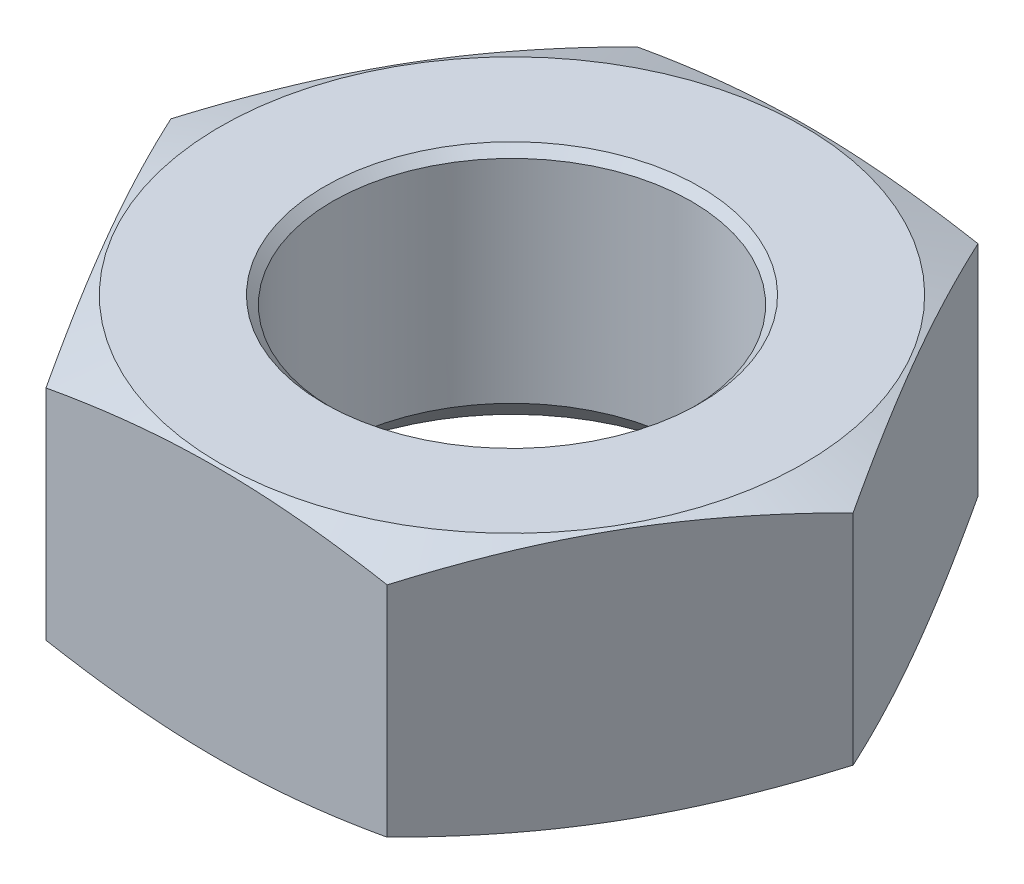
ISO-10303-21;
HEADER;
FILE_DESCRIPTION(('STEP AP214'),'2;1');
FILE_NAME('part.step','',(''),(''),'','','');
FILE_SCHEMA(('AUTOMOTIVE_DESIGN { 1 0 10303 214 1 1 1 1 }'));
ENDSEC;
DATA;
#1=APPLICATION_CONTEXT('core data for automotive mechanical design processes');
#2=APPLICATION_PROTOCOL_DEFINITION('international standard','automotive_design',2000,#1);
#3=PRODUCT_CONTEXT('',#1,'mechanical');
#4=PRODUCT('Part','Part','',(#3));
#5=PRODUCT_RELATED_PRODUCT_CATEGORY('part','',(#4));
#6=PRODUCT_DEFINITION_FORMATION('','',#4);
#7=PRODUCT_DEFINITION_CONTEXT('part definition',#1,'design');
#8=PRODUCT_DEFINITION('design','',#6,#7);
#9=PRODUCT_DEFINITION_SHAPE('','',#8);
#10=(LENGTH_UNIT() NAMED_UNIT(*) SI_UNIT(.MILLI.,.METRE.));
#11=(NAMED_UNIT(*) PLANE_ANGLE_UNIT() SI_UNIT($,.RADIAN.));
#12=(NAMED_UNIT(*) SI_UNIT($,.STERADIAN.) SOLID_ANGLE_UNIT());
#13=UNCERTAINTY_MEASURE_WITH_UNIT(LENGTH_MEASURE(1.E-05),#10,'distance_accuracy_value','');
#14=(GEOMETRIC_REPRESENTATION_CONTEXT(3) GLOBAL_UNCERTAINTY_ASSIGNED_CONTEXT((#13)) GLOBAL_UNIT_ASSIGNED_CONTEXT((#10,
#11,#12)) REPRESENTATION_CONTEXT('',''));
#15=CARTESIAN_POINT('',(0.,0.,0.));
#16=DIRECTION('',(0.,0.,1.));
#17=DIRECTION('',(1.,0.,0.));
#18=AXIS2_PLACEMENT_3D('',#15,#16,#17);
#19=CARTESIAN_POINT('',(8.08290376865476,6.,0.));
#20=DIRECTION('',(-0.866025403784438,0.,0.5));
#21=DIRECTION('',(0.5,0.,0.866025403784439));
#22=AXIS2_PLACEMENT_3D('',#19,#20,#21);
#23=PLANE('',#22);
#24=CARTESIAN_POINT('',(4.04133641427354,0.396064374006002,-7.0002));
#25=CARTESIAN_POINT('',(4.20871133711686,0.335122246639036,-6.71029812972245));
#26=CARTESIAN_POINT('',(4.37663818867554,0.279684845159645,-6.41944029086774));
#27=CARTESIAN_POINT('',(4.71358376499552,0.182151327336367,-5.83583343329596));
#28=CARTESIAN_POINT('',(4.88260323922986,0.140065650577549,-5.5430831164535));
#29=CARTESIAN_POINT('',(5.21985834048189,0.0719932787650603,-4.9589401459732));
#30=CARTESIAN_POINT('',(5.3880862654455,0.0458581080277517,-4.66756083268434));
#31=CARTESIAN_POINT('',(5.72493551662129,0.0108034998647016,-4.08412081515635));
#32=CARTESIAN_POINT('',(5.89355667155618,0.00187760707785246,-3.79206040757817));
#33=CARTESIAN_POINT('',(6.23079898142596,0.00187760707785257,-3.20793959242183));
#34=CARTESIAN_POINT('',(6.39942013636085,0.0108034998647018,-2.91587918484365));
#35=CARTESIAN_POINT('',(6.73626938753664,0.0458581080277517,-2.33243916731566));
#36=CARTESIAN_POINT('',(6.90449731250025,0.07199327876506,-2.0410598540268));
#37=CARTESIAN_POINT('',(7.24175241375227,0.140065650577549,-1.45691688354651));
#38=CARTESIAN_POINT('',(7.41077188798662,0.182151327336367,-1.16416656670404));
#39=CARTESIAN_POINT('',(7.7477174643066,0.279684845159646,-0.580559709132259));
#40=CARTESIAN_POINT('',(7.91564431586528,0.335122246639037,-0.289701870277549));
#41=CARTESIAN_POINT('',(8.0830192387086,0.396064374006002,0.000199999999999736));
#42=B_SPLINE_CURVE_WITH_KNOTS('',3,(#24,#25,#26,#27,#28,#29,#30,#31,#32,#33,#34,#35,#36,#37,#38,
#39,#40,#41),.UNSPECIFIED.,.F.,.F.,(4,2,2,2,2,2,2,2,4),(0.,1.02086119756332,2.04251864059741,
3.05451483401204,4.06613134427776,5.07774785454349,6.08974404795812,7.11140149099221,
8.13226268855553),.UNSPECIFIED.);
#43=CARTESIAN_POINT('',(4.04145188432738,0.396022345442876,-7.));
#44=VERTEX_POINT('',#43);
#45=CARTESIAN_POINT('',(8.08290376865476,0.396022345442876,0.));
#46=VERTEX_POINT('',#45);
#47=EDGE_CURVE('E66',#44,#46,#42,.T.);
#48=ORIENTED_EDGE('',*,*,#47,.F.);
#49=DIRECTION('',(0.,-1.,0.));
#50=VECTOR('',#49,1.);
#51=CARTESIAN_POINT('',(4.04145188432738,6.,-7.));
#52=LINE('',#51,#50);
#53=CARTESIAN_POINT('',(4.04145188432738,5.57467753879998,-7.));
#54=VERTEX_POINT('',#53);
#55=EDGE_CURVE('E136',#54,#44,#52,.T.);
#56=ORIENTED_EDGE('',*,*,#55,.F.);
#57=CARTESIAN_POINT('',(8.0830192387086,5.57463551023685,0.000199999999998542));
#58=CARTESIAN_POINT('',(7.91564431586528,5.63557763760382,-0.289701870277549));
#59=CARTESIAN_POINT('',(7.7477174643066,5.69101503908321,-0.58055970913226));
#60=CARTESIAN_POINT('',(7.41077188798662,5.78854855690649,-1.16416656670404));
#61=CARTESIAN_POINT('',(7.24175241375227,5.83063423366531,-1.45691688354651));
#62=CARTESIAN_POINT('',(6.90449731250025,5.89870660547779,-2.0410598540268));
#63=CARTESIAN_POINT('',(6.73626938753664,5.9248417762151,-2.33243916731566));
#64=CARTESIAN_POINT('',(6.39942013636085,5.95989638437815,-2.91587918484365));
#65=CARTESIAN_POINT('',(6.23079898142596,5.968822277165,-3.20793959242183));
#66=CARTESIAN_POINT('',(5.89355667155618,5.968822277165,-3.79206040757818));
#67=CARTESIAN_POINT('',(5.72493551662129,5.95989638437815,-4.08412081515635));
#68=CARTESIAN_POINT('',(5.3880862654455,5.9248417762151,-4.66756083268435));
#69=CARTESIAN_POINT('',(5.21985834048189,5.89870660547779,-4.9589401459732));
#70=CARTESIAN_POINT('',(4.88260323922986,5.83063423366531,-5.5430831164535));
#71=CARTESIAN_POINT('',(4.71358376499552,5.78854855690649,-5.83583343329597));
#72=CARTESIAN_POINT('',(4.37663818867554,5.69101503908321,-6.41944029086774));
#73=CARTESIAN_POINT('',(4.20871133711686,5.63557763760382,-6.71029812972245));
#74=CARTESIAN_POINT('',(4.04133641427354,5.57463551023685,-7.0002));
#75=B_SPLINE_CURVE_WITH_KNOTS('',3,(#57,#58,#59,#60,#61,#62,#63,#64,#65,#66,#67,#68,#69,#70,#71,
#72,#73,#74),.UNSPECIFIED.,.F.,.F.,(4,2,2,2,2,2,2,2,4),(0.,1.02086119756332,2.04251864059741,
3.05451483401204,4.06613134427776,5.07774785454349,6.08974404795813,7.11140149099221,
8.13226268855553),.UNSPECIFIED.);
#76=CARTESIAN_POINT('',(8.08290376865476,5.57467753879998,0.));
#77=VERTEX_POINT('',#76);
#78=EDGE_CURVE('E171',#77,#54,#75,.T.);
#79=ORIENTED_EDGE('',*,*,#78,.F.);
#80=DIRECTION('',(0.,-1.,0.));
#81=VECTOR('',#80,1.);
#82=CARTESIAN_POINT('',(8.08290376865476,6.,0.));
#83=LINE('',#82,#81);
#84=EDGE_CURVE('E123',#77,#46,#83,.T.);
#85=ORIENTED_EDGE('',*,*,#84,.T.);
#86=EDGE_LOOP('',(#48,#56,#79,#85));
#87=FACE_BOUND('',#86,.T.);
#88=ADVANCED_FACE('F51',(#87),#23,.F.);
#89=CARTESIAN_POINT('',(4.04145188432738,6.,-7.));
#90=DIRECTION('',(0.,0.,1.));
#91=DIRECTION('',(1.,0.,0.));
#92=AXIS2_PLACEMENT_3D('',#89,#90,#91);
#93=PLANE('',#92);
#94=CARTESIAN_POINT('',(-10.9485211877735,2.18388043867812,-7.));
#95=CARTESIAN_POINT('',(-10.6287207711999,2.08583957313408,-7.));
#96=CARTESIAN_POINT('',(-10.3085797591897,1.98889028675174,-7.));
#97=CARTESIAN_POINT('',(-9.66744222277763,1.79777920144253,-7.));
#98=CARTESIAN_POINT('',(-9.3464456374255,1.70361760722536,-7.));
#99=CARTESIAN_POINT('',(-8.70295049180292,1.51855153074337,-7.));
#100=CARTESIAN_POINT('',(-8.3804503434425,1.42765255149168,-7.));
#101=CARTESIAN_POINT('',(-7.73428276866216,1.25010854917304,-7.));
#102=CARTESIAN_POINT('',(-7.41061536187956,1.16346345489611,-7.));
#103=CARTESIAN_POINT('',(-6.76640422744777,0.996653271204069,-7.));
#104=CARTESIAN_POINT('',(-6.44587956949562,0.916414882974371,-7.));
#105=CARTESIAN_POINT('',(-5.8032654822088,0.762401302900801,-7.));
#106=CARTESIAN_POINT('',(-5.4811760276892,0.688626215448018,-7.));
#107=CARTESIAN_POINT('',(-4.83529735099378,0.549171466831506,-7.));
#108=CARTESIAN_POINT('',(-4.51150845453678,0.483490309481984,-7.));
#109=CARTESIAN_POINT('',(-3.86204304322744,0.36215478230871,-7.));
#110=CARTESIAN_POINT('',(-3.53636658511651,0.306500112678832,-7.));
#111=CARTESIAN_POINT('',(-2.91905008750254,0.212852618808603,-7.));
#112=CARTESIAN_POINT('',(-2.62760437608833,0.173590752126177,-7.));
#113=CARTESIAN_POINT('',(-2.04340816078659,0.106297980961866,-7.));
#114=CARTESIAN_POINT('',(-1.75065769467274,0.0782667534524882,-7.));
#115=CARTESIAN_POINT('',(-1.16447081425554,0.0347810089868492,-7.));
#116=CARTESIAN_POINT('',(-0.87103524192869,0.0193153251655916,-7.));
#117=CARTESIAN_POINT('',(-0.2837602517252,0.00174526968958046,-7.));
#118=CARTESIAN_POINT('',(0.010079161886226,-0.000359242012475616,-7.));
#119=CARTESIAN_POINT('',(0.599472244446039,0.00894191192003661,-7.));
#120=CARTESIAN_POINT('',(0.895024488719582,0.0204364541140329,-7.));
#121=CARTESIAN_POINT('',(1.48532841918403,0.056447033068986,-7.));
#122=CARTESIAN_POINT('',(1.7800800836161,0.0809634202586504,-7.));
#123=CARTESIAN_POINT('',(2.36864161633583,0.141820709098466,-7.));
#124=CARTESIAN_POINT('',(2.66245023950899,0.178173476551868,-7.));
#125=CARTESIAN_POINT('',(3.24858689742442,0.261152930135638,-7.));
#126=CARTESIAN_POINT('',(3.54091495958117,0.307779425318108,-7.));
#127=CARTESIAN_POINT('',(4.23196960676043,0.428562844120552,-7.));
#128=CARTESIAN_POINT('',(4.63002796583827,0.506521845549633,-7.));
#129=CARTESIAN_POINT('',(5.42350551185061,0.674975999784169,-7.));
#130=CARTESIAN_POINT('',(5.81892424824167,0.765473238086787,-7.));
#131=CARTESIAN_POINT('',(6.60768078151876,0.956047588223404,-7.));
#132=CARTESIAN_POINT('',(7.00101717346271,1.05613046734656,-7.));
#133=CARTESIAN_POINT('',(7.78573912449614,1.26353510973388,-7.));
#134=CARTESIAN_POINT('',(8.17712479444821,1.37085645646868,-7.));
#135=CARTESIAN_POINT('',(8.95924418715844,1.59130439861363,-7.));
#136=CARTESIAN_POINT('',(9.34997421334021,1.70444405021298,-7.));
#137=CARTESIAN_POINT('',(10.1301595767984,1.93503632103804,-7.));
#138=CARTESIAN_POINT('',(10.519614900854,2.05248898484356,-7.));
#139=CARTESIAN_POINT('',(11.2973508014013,2.29072933179644,-7.));
#140=CARTESIAN_POINT('',(11.6856317451897,2.41151581871155,-7.));
#141=CARTESIAN_POINT('',(12.4613492572386,2.65577339257445,-7.));
#142=CARTESIAN_POINT('',(12.8487858203017,2.77924449599556,-7.));
#143=CARTESIAN_POINT('',(13.9954888231199,3.14817657710073,-7.));
#144=CARTESIAN_POINT('',(14.7537739551729,3.3966857579965,-7.));
#145=CARTESIAN_POINT('',(16.2685842192029,3.89924241100966,-7.));
#146=CARTESIAN_POINT('',(17.0251091630256,4.1532904475825,-7.));
#147=CARTESIAN_POINT('',(18.5325656692692,4.66382308181994,-7.));
#148=CARTESIAN_POINT('',(19.2835046618543,4.92028576312942,-7.));
#149=CARTESIAN_POINT('',(20.4091441067629,5.30705894940449,-7.));
#150=CARTESIAN_POINT('',(20.7842053757307,5.43632162816848,-7.));
#151=CARTESIAN_POINT('',(21.5341170939655,5.69545520336172,-7.));
#152=CARTESIAN_POINT('',(21.9089675435711,5.82532609881113,-7.));
#153=CARTESIAN_POINT('',(22.2837280092243,5.95545626223759,-7.));
#154=B_SPLINE_CURVE_WITH_KNOTS('',3,(#94,#95,#96,#97,#98,#99,#100,#101,#102,#103,#104,#105,#106,
#107,#108,#109,#110,#111,#112,#113,#114,#115,#116,#117,#118,#119,#120,#121,#122,#123,#124,#125,
#126,#127,#128,#129,#130,#131,#132,#133,#134,#135,#136,#137,#138,#139,#140,#141,#142,#143,#144,
#145,#146,#147,#148,#149,#150,#151,#152,#153),.UNSPECIFIED.,.F.,.F.,(4,2,2,2,2,2,2,2,2,2,2,2,2,
2,2,2,2,2,2,2,2,2,2,2,2,2,2,2,2,4),(0.,1.0034799704372,2.00703344794841,3.0122068704026,
4.0173634605259,5.00855641002246,5.99976536568141,6.99079081784013,7.98178663201977,
8.86383488356017,9.74585776287652,10.6270959378272,11.5083248759211,12.3953450408392,
13.2823890774192,14.1703251151807,15.0582446511206,16.2748233455727,17.4916046382219,
18.7091226732822,19.9265707073311,21.1468812456421,22.3672044007853,23.5870952342648,
24.8069935553426,27.2008610244916,29.5949735996028,31.9755414298882,33.16567475803,
34.3558061695529),.UNSPECIFIED.);
#155=CARTESIAN_POINT('',(-4.04145188432738,0.396022345442877,-7.));
#156=VERTEX_POINT('',#155);
#157=EDGE_CURVE('E187',#156,#44,#154,.T.);
#158=ORIENTED_EDGE('',*,*,#157,.F.);
#159=DIRECTION('',(0.,-1.,0.));
#160=VECTOR('',#159,1.);
#161=CARTESIAN_POINT('',(-4.04145188432738,6.,-7.));
#162=LINE('',#161,#160);
#163=CARTESIAN_POINT('',(-4.04145188432738,5.57467753879998,-7.));
#164=VERTEX_POINT('',#163);
#165=EDGE_CURVE('E133',#164,#156,#162,.T.);
#166=ORIENTED_EDGE('',*,*,#165,.F.);
#167=CARTESIAN_POINT('',(-10.9443649283452,3.78809389805981,-7.));
#168=CARTESIAN_POINT('',(-10.6246092215278,3.88611023547175,-7.));
#169=CARTESIAN_POINT('',(-10.3045127651647,3.98303439464673,-7.));
#170=CARTESIAN_POINT('',(-9.66346396038173,4.17409368224225,-7.));
#171=CARTESIAN_POINT('',(-9.34251155090198,4.26822860555747,-7.));
#172=CARTESIAN_POINT('',(-8.6991035009825,4.45323965918219,-7.));
#173=CARTESIAN_POINT('',(-8.37664626895604,4.54411027348403,-7.));
#174=CARTESIAN_POINT('',(-7.73056410552521,4.72159514981922,-7.));
#175=CARTESIAN_POINT('',(-7.40693919379323,4.80820948320387,-7.));
#176=CARTESIAN_POINT('',(-6.76281943917446,4.97495374669194,-7.));
#177=CARTESIAN_POINT('',(-6.44234370282832,5.05515713558021,-7.));
#178=CARTESIAN_POINT('',(-5.79982721150906,5.20909764525514,-7.));
#179=CARTESIAN_POINT('',(-5.47778643133343,5.28283466154465,-7.));
#180=CARTESIAN_POINT('',(-4.83200557170853,5.42220973820928,-7.));
#181=CARTESIAN_POINT('',(-4.50826582067547,5.48784930778622,-7.));
#182=CARTESIAN_POINT('',(-3.85889911618836,5.60909821608519,-7.));
#183=CARTESIAN_POINT('',(-3.53327221956052,5.66470785522794,-7.));
#184=CARTESIAN_POINT('',(-2.91606261242783,5.75826573872885,-7.));
#185=CARTESIAN_POINT('',(-2.62467418441483,5.79748372375209,-7.));
#186=CARTESIAN_POINT('',(-2.04059398132959,5.86468866225707,-7.));
#187=CARTESIAN_POINT('',(-1.74790224401797,5.8926759390113,-7.));
#188=CARTESIAN_POINT('',(-1.16183426849998,5.9360757756382,-7.));
#189=CARTESIAN_POINT('',(-0.868458869597712,5.95149948672617,-7.));
#190=CARTESIAN_POINT('',(-0.281306094139779,5.96898987780636,-7.));
#191=CARTESIAN_POINT('',(0.0124712782042699,5.97105669668777,-7.));
#192=CARTESIAN_POINT('',(0.601741725714245,5.96168631778636,-7.));
#193=CARTESIAN_POINT('',(0.897233363434976,5.95016012838143,-7.));
#194=CARTESIAN_POINT('',(1.48741514352659,5.91409385478955,-7.));
#195=CARTESIAN_POINT('',(1.78210526411096,5.88955342033875,-7.));
#196=CARTESIAN_POINT('',(2.37054331113329,5.82865595280675,-7.));
#197=CARTESIAN_POINT('',(2.66428999267666,5.79228706618425,-7.));
#198=CARTESIAN_POINT('',(3.25030304000823,5.7092827492109,-7.));
#199=CARTESIAN_POINT('',(3.54256943342517,5.66264751120343,-7.));
#200=CARTESIAN_POINT('',(4.23399876300188,5.54175998450957,-7.));
#201=CARTESIAN_POINT('',(4.63249004014467,5.46368722311754,-7.));
#202=CARTESIAN_POINT('',(5.42682837844222,5.2949863165904,-7.));
#203=CARTESIAN_POINT('',(5.82267498714493,5.20435607799125,-7.));
#204=CARTESIAN_POINT('',(6.61228427578391,5.01350397808731,-7.));
#205=CARTESIAN_POINT('',(7.00604554590611,4.9132763316836,-7.));
#206=CARTESIAN_POINT('',(7.79161468922094,4.70557543545143,-7.));
#207=CARTESIAN_POINT('',(8.18342267372247,4.59810260368124,-7.));
#208=CARTESIAN_POINT('',(8.9663870191392,4.37734726350882,-7.));
#209=CARTESIAN_POINT('',(9.35753967612868,4.26405167706565,-7.));
#210=CARTESIAN_POINT('',(10.1385693403171,4.03314543755379,-7.));
#211=CARTESIAN_POINT('',(10.5284463342436,3.91553473974354,-7.));
#212=CARTESIAN_POINT('',(11.3070245893876,3.6769774045527,-7.));
#213=CARTESIAN_POINT('',(11.6957262187898,3.55603196600105,-7.));
#214=CARTESIAN_POINT('',(12.4722847756653,3.31145604105284,-7.));
#215=CARTESIAN_POINT('',(12.8601416979466,3.18782553820335,-7.));
#216=CARTESIAN_POINT('',(14.008021611314,2.81844305749614,-7.));
#217=CARTESIAN_POINT('',(14.7670633042413,2.56964350020239,-7.));
#218=CARTESIAN_POINT('',(16.2833872160988,2.06650768649481,-7.));
#219=CARTESIAN_POINT('',(17.0406692465105,1.81217086461723,-7.));
#220=CARTESIAN_POINT('',(18.5496344562916,1.3010644205353,-7.));
#221=CARTESIAN_POINT('',(19.3013250663795,1.04431671365929,-7.));
#222=CARTESIAN_POINT('',(20.4280921211889,0.657117078328839,-7.));
#223=CARTESIAN_POINT('',(20.8035292369718,0.527712450800342,-7.));
#224=CARTESIAN_POINT('',(21.5541927420264,0.268295300787533,-7.));
#225=CARTESIAN_POINT('',(21.9294191316357,0.138282779280086,-7.));
#226=CARTESIAN_POINT('',(22.3045555810193,0.0080111376128979,-7.));
#227=B_SPLINE_CURVE_WITH_KNOTS('',3,(#167,#168,#169,#170,#171,#172,#173,#174,#175,#176,#177,
#178,#179,#180,#181,#182,#183,#184,#185,#186,#187,#188,#189,#190,#191,#192,#193,#194,#195,#196,
#197,#198,#199,#200,#201,#202,#203,#204,#205,#206,#207,#208,#209,#210,#211,#212,#213,#214,#215,
#216,#217,#218,#219,#220,#221,#222,#223,#224,#225,#226),.UNSPECIFIED.,.F.,.F.,(4,2,2,2,2,2,2,2,
2,2,2,2,2,2,2,2,2,2,2,2,2,2,2,2,2,2,2,2,2,4),(0.,1.00333017294575,2.00673394318622,
3.0117603316058,4.01676986624558,5.00779488903206,5.99883592392139,6.98969196865276,
7.980518329913,8.86237863708462,9.74421355835637,10.6252649218891,11.5063071239564,
12.393149559755,13.2800158651374,14.1677736705888,15.0555148450291,16.2734329307276,
17.4915543010743,18.7104146055821,19.9292046400878,21.150863155524,22.3725343413969,
23.5937719238525,24.8150169916473,27.211312620459,29.6078541168339,31.9908321602574,
33.1821702521295,34.3735064302193),.UNSPECIFIED.);
#228=EDGE_CURVE('E238',#54,#164,#227,.F.);
#229=ORIENTED_EDGE('',*,*,#228,.F.);
#230=ORIENTED_EDGE('',*,*,#55,.T.);
#231=EDGE_LOOP('',(#158,#166,#229,#230));
#232=FACE_BOUND('',#231,.T.);
#233=ADVANCED_FACE('F158',(#232),#93,.F.);
#234=CARTESIAN_POINT('',(-4.04145188432738,6.,-7.));
#235=DIRECTION('',(0.866025403784439,0.,0.5));
#236=DIRECTION('',(0.5,0.,-0.866025403784439));
#237=AXIS2_PLACEMENT_3D('',#234,#235,#236);
#238=PLANE('',#237);
#239=CARTESIAN_POINT('',(-8.0830192387086,0.396064374006002,0.000200000000002535));
#240=CARTESIAN_POINT('',(-7.91564431586528,0.335122246639037,-0.289701870277545));
#241=CARTESIAN_POINT('',(-7.7477174643066,0.279684845159646,-0.580559709132257));
#242=CARTESIAN_POINT('',(-7.41077188798662,0.182151327336367,-1.16416656670403));
#243=CARTESIAN_POINT('',(-7.24175241375228,0.140065650577549,-1.4569168835465));
#244=CARTESIAN_POINT('',(-6.90449731250025,0.0719932787650603,-2.0410598540268));
#245=CARTESIAN_POINT('',(-6.73626938753664,0.0458581080277516,-2.33243916731565));
#246=CARTESIAN_POINT('',(-6.39942013636085,0.0108034998647017,-2.91587918484365));
#247=CARTESIAN_POINT('',(-6.23079898142596,0.00187760707785282,-3.20793959242183));
#248=CARTESIAN_POINT('',(-5.89355667155618,0.00187760707785286,-3.79206040757817));
#249=CARTESIAN_POINT('',(-5.72493551662129,0.0108034998647018,-4.08412081515635));
#250=CARTESIAN_POINT('',(-5.3880862654455,0.0458581080277517,-4.66756083268434));
#251=CARTESIAN_POINT('',(-5.21985834048189,0.0719932787650603,-4.9589401459732));
#252=CARTESIAN_POINT('',(-4.88260323922987,0.140065650577549,-5.54308311645349));
#253=CARTESIAN_POINT('',(-4.71358376499552,0.182151327336367,-5.83583343329596));
#254=CARTESIAN_POINT('',(-4.37663818867554,0.279684845159646,-6.41944029086774));
#255=CARTESIAN_POINT('',(-4.20871133711686,0.335122246639037,-6.71029812972245));
#256=CARTESIAN_POINT('',(-4.04133641427354,0.396064374006003,-7.0002));
#257=B_SPLINE_CURVE_WITH_KNOTS('',3,(#239,#240,#241,#242,#243,#244,#245,#246,#247,#248,#249,
#250,#251,#252,#253,#254,#255,#256),.UNSPECIFIED.,.F.,.F.,(4,2,2,2,2,2,2,2,4),(0.,
1.02086119756332,2.04251864059741,3.05451483401204,4.06613134427776,5.0777478545435,
6.08974404795813,7.11140149099221,8.13226268855553),.UNSPECIFIED.);
#258=CARTESIAN_POINT('',(-8.08290376865476,0.396022345442876,0.));
#259=VERTEX_POINT('',#258);
#260=EDGE_CURVE('E220',#259,#156,#257,.T.);
#261=ORIENTED_EDGE('',*,*,#260,.F.);
#262=DIRECTION('',(0.,-1.,0.));
#263=VECTOR('',#262,1.);
#264=CARTESIAN_POINT('',(-8.08290376865476,6.,0.));
#265=LINE('',#264,#263);
#266=CARTESIAN_POINT('',(-8.08290376865476,5.57467753879998,0.));
#267=VERTEX_POINT('',#266);
#268=EDGE_CURVE('E125',#267,#259,#265,.T.);
#269=ORIENTED_EDGE('',*,*,#268,.F.);
#270=CARTESIAN_POINT('',(-4.04133641427354,5.57463551023685,-7.0002));
#271=CARTESIAN_POINT('',(-4.20871133711686,5.63557763760382,-6.71029812972245));
#272=CARTESIAN_POINT('',(-4.37663818867554,5.69101503908321,-6.41944029086774));
#273=CARTESIAN_POINT('',(-4.71358376499552,5.78854855690649,-5.83583343329596));
#274=CARTESIAN_POINT('',(-4.88260323922987,5.83063423366531,-5.5430831164535));
#275=CARTESIAN_POINT('',(-5.21985834048189,5.89870660547779,-4.9589401459732));
#276=CARTESIAN_POINT('',(-5.3880862654455,5.9248417762151,-4.66756083268434));
#277=CARTESIAN_POINT('',(-5.72493551662129,5.95989638437815,-4.08412081515635));
#278=CARTESIAN_POINT('',(-5.89355667155618,5.968822277165,-3.79206040757817));
#279=CARTESIAN_POINT('',(-6.23079898142596,5.968822277165,-3.20793959242183));
#280=CARTESIAN_POINT('',(-6.39942013636085,5.95989638437815,-2.91587918484365));
#281=CARTESIAN_POINT('',(-6.73626938753664,5.9248417762151,-2.33243916731566));
#282=CARTESIAN_POINT('',(-6.90449731250025,5.89870660547779,-2.0410598540268));
#283=CARTESIAN_POINT('',(-7.24175241375227,5.83063423366531,-1.45691688354651));
#284=CARTESIAN_POINT('',(-7.41077188798662,5.78854855690649,-1.16416656670404));
#285=CARTESIAN_POINT('',(-7.7477174643066,5.69101503908321,-0.580559709132259));
#286=CARTESIAN_POINT('',(-7.91564431586528,5.63557763760382,-0.289701870277548));
#287=CARTESIAN_POINT('',(-8.0830192387086,5.57463551023685,0.000200000000000626));
#288=B_SPLINE_CURVE_WITH_KNOTS('',3,(#270,#271,#272,#273,#274,#275,#276,#277,#278,#279,#280,
#281,#282,#283,#284,#285,#286,#287),.UNSPECIFIED.,.F.,.F.,(4,2,2,2,2,2,2,2,4),(0.,
1.02086119756332,2.04251864059741,3.05451483401204,4.06613134427776,5.07774785454349,
6.08974404795812,7.11140149099221,8.13226268855553),.UNSPECIFIED.);
#289=EDGE_CURVE('E232',#164,#267,#288,.T.);
#290=ORIENTED_EDGE('',*,*,#289,.F.);
#291=ORIENTED_EDGE('',*,*,#165,.T.);
#292=EDGE_LOOP('',(#261,#269,#290,#291));
#293=FACE_BOUND('',#292,.T.);
#294=ADVANCED_FACE('F163',(#293),#238,.F.);
#295=CARTESIAN_POINT('',(-8.08290376865476,6.,0.));
#296=DIRECTION('',(0.866025403784438,0.,-0.5));
#297=DIRECTION('',(-0.5,0.,-0.866025403784439));
#298=AXIS2_PLACEMENT_3D('',#295,#296,#297);
#299=PLANE('',#298);
#300=CARTESIAN_POINT('',(-4.04133641427354,0.396064374006002,7.0002));
#301=CARTESIAN_POINT('',(-4.20871133711686,0.335122246639036,6.71029812972245));
#302=CARTESIAN_POINT('',(-4.37663818867554,0.279684845159645,6.41944029086774));
#303=CARTESIAN_POINT('',(-4.71358376499551,0.182151327336367,5.83583343329596));
#304=CARTESIAN_POINT('',(-4.88260323922986,0.140065650577549,5.5430831164535));
#305=CARTESIAN_POINT('',(-5.21985834048189,0.07199327876506,4.9589401459732));
#306=CARTESIAN_POINT('',(-5.3880862654455,0.0458581080277516,4.66756083268435));
#307=CARTESIAN_POINT('',(-5.72493551662129,0.0108034998647017,4.08412081515635));
#308=CARTESIAN_POINT('',(-5.89355667155618,0.00187760707785267,3.79206040757817));
#309=CARTESIAN_POINT('',(-6.23079898142596,0.00187760707785269,3.20793959242183));
#310=CARTESIAN_POINT('',(-6.39942013636085,0.0108034998647018,2.91587918484365));
#311=CARTESIAN_POINT('',(-6.73626938753664,0.0458581080277517,2.33243916731566));
#312=CARTESIAN_POINT('',(-6.90449731250025,0.0719932787650602,2.0410598540268));
#313=CARTESIAN_POINT('',(-7.24175241375227,0.140065650577549,1.45691688354651));
#314=CARTESIAN_POINT('',(-7.41077188798662,0.182151327336367,1.16416656670404));
#315=CARTESIAN_POINT('',(-7.7477174643066,0.279684845159646,0.580559709132261));
#316=CARTESIAN_POINT('',(-7.91564431586528,0.335122246639037,0.28970187027755));
#317=CARTESIAN_POINT('',(-8.0830192387086,0.396064374006002,-0.000199999999998666));
#318=B_SPLINE_CURVE_WITH_KNOTS('',3,(#300,#301,#302,#303,#304,#305,#306,#307,#308,#309,#310,
#311,#312,#313,#314,#315,#316,#317),.UNSPECIFIED.,.F.,.F.,(4,2,2,2,2,2,2,2,4),(0.,
1.02086119756332,2.04251864059741,3.05451483401204,4.06613134427776,5.07774785454349,
6.08974404795813,7.11140149099221,8.13226268855553),.UNSPECIFIED.);
#319=CARTESIAN_POINT('',(-4.04145188432738,0.396022345442867,7.));
#320=VERTEX_POINT('',#319);
#321=EDGE_CURVE('E119',#320,#259,#318,.T.);
#322=ORIENTED_EDGE('',*,*,#321,.F.);
#323=DIRECTION('',(0.,-1.,0.));
#324=VECTOR('',#323,1.);
#325=CARTESIAN_POINT('',(-4.04145188432738,6.,7.));
#326=LINE('',#325,#324);
#327=CARTESIAN_POINT('',(-4.04145188432738,5.57467753879999,7.));
#328=VERTEX_POINT('',#327);
#329=EDGE_CURVE('E118',#328,#320,#326,.T.);
#330=ORIENTED_EDGE('',*,*,#329,.F.);
#331=CARTESIAN_POINT('',(-8.0830192387086,5.57463551023685,-0.000199999999997322));
#332=CARTESIAN_POINT('',(-7.91564431586528,5.63557763760382,0.28970187027755));
#333=CARTESIAN_POINT('',(-7.7477174643066,5.69101503908321,0.580559709132262));
#334=CARTESIAN_POINT('',(-7.41077188798662,5.78854855690649,1.16416656670404));
#335=CARTESIAN_POINT('',(-7.24175241375227,5.83063423366531,1.45691688354651));
#336=CARTESIAN_POINT('',(-6.90449731250025,5.89870660547779,2.0410598540268));
#337=CARTESIAN_POINT('',(-6.73626938753664,5.9248417762151,2.33243916731566));
#338=CARTESIAN_POINT('',(-6.39942013636085,5.95989638437815,2.91587918484366));
#339=CARTESIAN_POINT('',(-6.23079898142596,5.968822277165,3.20793959242183));
#340=CARTESIAN_POINT('',(-5.89355667155618,5.968822277165,3.79206040757818));
#341=CARTESIAN_POINT('',(-5.72493551662129,5.95989638437815,4.08412081515635));
#342=CARTESIAN_POINT('',(-5.3880862654455,5.9248417762151,4.66756083268435));
#343=CARTESIAN_POINT('',(-5.21985834048189,5.89870660547779,4.9589401459732));
#344=CARTESIAN_POINT('',(-4.88260323922986,5.83063423366531,5.5430831164535));
#345=CARTESIAN_POINT('',(-4.71358376499551,5.78854855690649,5.83583343329597));
#346=CARTESIAN_POINT('',(-4.37663818867554,5.69101503908321,6.41944029086774));
#347=CARTESIAN_POINT('',(-4.20871133711686,5.63557763760382,6.71029812972245));
#348=CARTESIAN_POINT('',(-4.04133641427354,5.57463551023685,7.0002));
#349=B_SPLINE_CURVE_WITH_KNOTS('',3,(#331,#332,#333,#334,#335,#336,#337,#338,#339,#340,#341,
#342,#343,#344,#345,#346,#347,#348),.UNSPECIFIED.,.F.,.F.,(4,2,2,2,2,2,2,2,4),(0.,
1.02086119756332,2.04251864059741,3.05451483401204,4.06613134427776,5.07774785454349,
6.08974404795813,7.11140149099221,8.13226268855553),.UNSPECIFIED.);
#350=EDGE_CURVE('E239',#267,#328,#349,.T.);
#351=ORIENTED_EDGE('',*,*,#350,.F.);
#352=ORIENTED_EDGE('',*,*,#268,.T.);
#353=EDGE_LOOP('',(#322,#330,#351,#352));
#354=FACE_BOUND('',#353,.T.);
#355=ADVANCED_FACE('F227',(#354),#299,.F.);
#356=CARTESIAN_POINT('',(-4.04145188432738,6.,7.));
#357=DIRECTION('',(0.,0.,-1.));
#358=DIRECTION('',(-1.,0.,0.));
#359=AXIS2_PLACEMENT_3D('',#356,#357,#358);
#360=PLANE('',#359);
#361=CARTESIAN_POINT('',(-10.9485211941431,2.18388044063135,7.));
#362=CARTESIAN_POINT('',(-10.6287207773217,2.08583957499481,7.));
#363=CARTESIAN_POINT('',(-10.3085797650635,1.98889028852021,7.));
#364=CARTESIAN_POINT('',(-9.66744222815504,1.79777920302758,7.));
#365=CARTESIAN_POINT('',(-9.34644564255446,1.70361760871923,7.));
#366=CARTESIAN_POINT('',(-8.70295049643284,1.51855153205612,7.));
#367=CARTESIAN_POINT('',(-8.38045034782181,1.42765255271451,7.));
#368=CARTESIAN_POINT('',(-7.73428277253926,1.25010855021876,7.));
#369=CARTESIAN_POINT('',(-7.41061536550506,1.16346345585464,7.));
#370=CARTESIAN_POINT('',(-6.76640423057258,0.996653271993726,7.));
#371=CARTESIAN_POINT('',(-6.44587957237136,0.91641488368229,7.));
#372=CARTESIAN_POINT('',(-5.80326548458447,0.762401303451468,7.));
#373=CARTESIAN_POINT('',(-5.48117602981386,0.688626215923172,7.));
#374=CARTESIAN_POINT('',(-4.83529735261453,0.549171467165048,7.));
#375=CARTESIAN_POINT('',(-4.51150845590462,0.483490309749412,7.));
#376=CARTESIAN_POINT('',(-3.86204304408659,0.362154782457344,7.));
#377=CARTESIAN_POINT('',(-3.53636658571989,0.306500112774781,7.));
#378=CARTESIAN_POINT('',(-2.91905008791824,0.212852618867738,7.));
#379=CARTESIAN_POINT('',(-2.62760437657395,0.173590752189326,7.));
#380=CARTESIAN_POINT('',(-2.04340816141252,0.106297981026761,7.));
#381=CARTESIAN_POINT('',(-1.75065769536904,0.0782667535151163,7.));
#382=CARTESIAN_POINT('',(-1.16447081509249,0.0347810090379823,7.));
#383=CARTESIAN_POINT('',(-0.871035242835929,0.0193153252075064,7.));
#384=CARTESIAN_POINT('',(-0.283760252772529,0.0017452697061471,7.));
#385=CARTESIAN_POINT('',(0.0100791607690869,-0.000359242012038805,7.));
#386=CARTESIAN_POINT('',(0.599472243187436,0.00894191188198656,7.));
#387=CARTESIAN_POINT('',(0.895024487389332,0.0204364540534781,7.));
#388=CARTESIAN_POINT('',(1.4853284177117,0.056447032958559,7.));
#389=CARTESIAN_POINT('',(1.78008008207335,0.0809634201208554,7.));
#390=CARTESIAN_POINT('',(2.3686416146531,0.141820708902703,7.));
#391=CARTESIAN_POINT('',(2.6624502377567,0.178173476325491,7.));
#392=CARTESIAN_POINT('',(3.24858689553404,0.261152929846311,7.));
#393=CARTESIAN_POINT('',(3.54091495762225,0.307779424996444,7.));
#394=CARTESIAN_POINT('',(4.23196960473159,0.428562843737517,7.));
#395=CARTESIAN_POINT('',(4.63002796380772,0.506521845141019,7.));
#396=CARTESIAN_POINT('',(5.42350550981623,0.67497599932979,7.));
#397=CARTESIAN_POINT('',(5.81892424620515,0.765473237612225,7.));
#398=CARTESIAN_POINT('',(6.60768077947759,0.956047587712738,7.));
#399=CARTESIAN_POINT('',(7.00101717141903,1.05613046681998,7.));
#400=CARTESIAN_POINT('',(7.78573912244679,1.26353510917866,7.));
#401=CARTESIAN_POINT('',(8.17712479239573,1.37085645590074,7.));
#402=CARTESIAN_POINT('',(8.95924418510049,1.59130439802298,7.));
#403=CARTESIAN_POINT('',(9.34997421127992,1.70444404961236,7.));
#404=CARTESIAN_POINT('',(10.130159574733,1.93503632041927,7.));
#405=CARTESIAN_POINT('',(10.5196148987858,2.05248898421662,7.));
#406=CARTESIAN_POINT('',(11.297350799327,2.29072933115445,7.));
#407=CARTESIAN_POINT('',(11.6856317431122,2.41151581806269,7.));
#408=CARTESIAN_POINT('',(12.4613492551543,2.65577339191287,7.));
#409=CARTESIAN_POINT('',(12.8487858182139,2.77924449532812,7.));
#410=CARTESIAN_POINT('',(13.9954888210553,3.14817657642799,7.));
#411=CARTESIAN_POINT('',(14.7537739531345,3.39668575732576,7.));
#412=CARTESIAN_POINT('',(16.2685842172163,3.89924241034511,7.));
#413=CARTESIAN_POINT('',(17.0251091610647,4.15329044692214,7.));
#414=CARTESIAN_POINT('',(18.5325656673541,4.66382308116764,7.));
#415=CARTESIAN_POINT('',(19.2835046599594,4.92028576248097,7.));
#416=CARTESIAN_POINT('',(20.4091441048982,5.30705894876244,7.));
#417=CARTESIAN_POINT('',(20.7842053738759,5.43632162752866,7.));
#418=CARTESIAN_POINT('',(21.5341170921306,5.69545520272654,7.));
#419=CARTESIAN_POINT('',(21.9089675417461,5.82532609817836,7.));
#420=CARTESIAN_POINT('',(22.2837280074092,5.95545626160729,7.));
#421=B_SPLINE_CURVE_WITH_KNOTS('',3,(#361,#362,#363,#364,#365,#366,#367,#368,#369,#370,#371,
#372,#373,#374,#375,#376,#377,#378,#379,#380,#381,#382,#383,#384,#385,#386,#387,#388,#389,#390,
#391,#392,#393,#394,#395,#396,#397,#398,#399,#400,#401,#402,#403,#404,#405,#406,#407,#408,#409,
#410,#411,#412,#413,#414,#415,#416,#417,#418,#419,#420),.UNSPECIFIED.,.F.,.F.,(4,2,2,2,2,2,2,2,
2,2,2,2,2,2,2,2,2,2,2,2,2,2,2,2,2,2,2,2,2,4),(0.,1.00347997122931,2.00703344953272,
3.01220687278371,4.01736346370376,5.00855641398466,5.99976537042807,6.99079082336961,
7.98178663833177,8.86383488966285,9.7458577687699,10.6270959435117,11.5083248813968,
12.3953450460977,13.2823890824604,14.1703251200036,15.0582446557252,16.2748233501573,
17.4916046427866,18.7091226778277,19.9265707118573,21.1468812501533,22.3672044052814,
23.5870952387454,24.8069935598078,27.2008610290335,29.5949736042215,31.9755414345681,
33.1656747627403,34.3558061742937),.UNSPECIFIED.);
#422=CARTESIAN_POINT('',(4.04145188432738,0.396022345442877,7.));
#423=VERTEX_POINT('',#422);
#424=EDGE_CURVE('E104',#423,#320,#421,.F.);
#425=ORIENTED_EDGE('',*,*,#424,.F.);
#426=DIRECTION('',(0.,-1.,0.));
#427=VECTOR('',#426,1.);
#428=CARTESIAN_POINT('',(4.04145188432738,6.,7.));
#429=LINE('',#428,#427);
#430=CARTESIAN_POINT('',(4.04145188432738,5.57467753879998,7.));
#431=VERTEX_POINT('',#430);
#432=EDGE_CURVE('E116',#431,#423,#429,.T.);
#433=ORIENTED_EDGE('',*,*,#432,.F.);
#434=CARTESIAN_POINT('',(-10.9443649342839,3.78809389623892,7.));
#435=CARTESIAN_POINT('',(-10.6246092272354,3.8861102337371,7.));
#436=CARTESIAN_POINT('',(-10.3045127706411,3.98303439299809,7.));
#437=CARTESIAN_POINT('',(-9.66346396539536,4.17409368076464,7.));
#438=CARTESIAN_POINT('',(-9.34251155568398,4.26822860416487,7.));
#439=CARTESIAN_POINT('',(-8.69910350529921,4.45323965795845,7.));
#440=CARTESIAN_POINT('',(-8.37664627303911,4.54411027234413,7.));
#441=CARTESIAN_POINT('',(-7.73056410914004,4.72159514884445,7.));
#442=CARTESIAN_POINT('',(-7.40693919717348,4.8082094823104,7.));
#443=CARTESIAN_POINT('',(-6.7628194420879,4.9749537459559,7.));
#444=CARTESIAN_POINT('',(-6.44234370550955,5.05515713492037,7.));
#445=CARTESIAN_POINT('',(-5.79982721372408,5.20909764474189,7.));
#446=CARTESIAN_POINT('',(-5.47778643331445,5.28283466110179,7.));
#447=CARTESIAN_POINT('',(-4.83200557321975,5.42220973789842,7.));
#448=CARTESIAN_POINT('',(-4.5082658219509,5.48784930753699,7.));
#449=CARTESIAN_POINT('',(-3.85889911698954,5.60909821594667,7.));
#450=CARTESIAN_POINT('',(-3.53327222012326,5.66470785513852,7.));
#451=CARTESIAN_POINT('',(-2.91606261281546,5.75826573867376,7.));
#452=CARTESIAN_POINT('',(-2.62467418486751,5.79748372369329,7.));
#453=CARTESIAN_POINT('',(-2.04059398191281,5.86468866219668,7.));
#454=CARTESIAN_POINT('',(-1.74790224466667,5.89267593895304,7.));
#455=CARTESIAN_POINT('',(-1.16183426927954,5.93607577559068,7.));
#456=CARTESIAN_POINT('',(-0.868458870442662,5.95149948668725,7.));
#457=CARTESIAN_POINT('',(-0.281306095115066,5.96898987779106,7.));
#458=CARTESIAN_POINT('',(0.0124712771640353,5.97105669668749,7.));
#459=CARTESIAN_POINT('',(0.601741724542395,5.96168631782193,7.));
#460=CARTESIAN_POINT('',(0.897233362196466,5.95016012843795,7.));
#461=CARTESIAN_POINT('',(1.48741514215589,5.9140938548925,7.));
#462=CARTESIAN_POINT('',(1.78210526267474,5.88955342046717,7.));
#463=CARTESIAN_POINT('',(2.37054330956683,5.82865595298912,7.));
#464=CARTESIAN_POINT('',(2.66428999104548,5.79228706639511,7.));
#465=CARTESIAN_POINT('',(3.25030303824857,5.70928274948034,7.));
#466=CARTESIAN_POINT('',(3.54256943160174,5.66264751150296,7.));
#467=CARTESIAN_POINT('',(4.23399876111337,5.54175998486624,7.));
#468=CARTESIAN_POINT('',(4.63249003825455,5.46368722349803,7.));
#469=CARTESIAN_POINT('',(5.42682837654851,5.29498631701352,7.));
#470=CARTESIAN_POINT('',(5.82267498524922,5.20435607843318,7.));
#471=CARTESIAN_POINT('',(6.61228427388384,5.01350397856285,7.));
#472=CARTESIAN_POINT('',(7.00604554400367,4.91327633217396,7.));
#473=CARTESIAN_POINT('',(7.7916146873132,4.70557543596846,7.));
#474=CARTESIAN_POINT('',(8.18342267181178,4.59810260421011,7.));
#475=CARTESIAN_POINT('',(8.96638701722337,4.37734726405884,7.));
#476=CARTESIAN_POINT('',(9.35753967421066,4.26405167762496,7.));
#477=CARTESIAN_POINT('',(10.1385693383943,4.03314543812999,7.));
#478=CARTESIAN_POINT('',(10.5284463323182,3.91553474032735,7.));
#479=CARTESIAN_POINT('',(11.3070245874565,3.67697740515052,7.));
#480=CARTESIAN_POINT('',(11.6957262168557,3.55603196660526,7.));
#481=CARTESIAN_POINT('',(12.4722847737248,3.31145604166891,7.));
#482=CARTESIAN_POINT('',(12.8601416960028,3.18782553882487,7.));
#483=CARTESIAN_POINT('',(14.0080216093918,2.81844305812258,7.));
#484=CARTESIAN_POINT('',(14.7670633023436,2.56964350082694,7.));
#485=CARTESIAN_POINT('',(16.2833872142494,2.06650768711356,7.));
#486=CARTESIAN_POINT('',(17.0406692446851,1.81217086523207,7.));
#487=CARTESIAN_POINT('',(18.549634454509,1.30106442114258,7.));
#488=CARTESIAN_POINT('',(19.3013250646156,1.04431671426297,7.));
#489=CARTESIAN_POINT('',(20.4280921194532,0.65711707892653,7.));
#490=CARTESIAN_POINT('',(20.8035292352453,0.527712451395947,7.));
#491=CARTESIAN_POINT('',(21.5541927403185,0.268295301378803,7.));
#492=CARTESIAN_POINT('',(21.929419129937,0.138282779869107,7.));
#493=CARTESIAN_POINT('',(22.3045555793298,0.00801113819960368,7.));
#494=B_SPLINE_CURVE_WITH_KNOTS('',3,(#434,#435,#436,#437,#438,#439,#440,#441,#442,#443,#444,
#445,#446,#447,#448,#449,#450,#451,#452,#453,#454,#455,#456,#457,#458,#459,#460,#461,#462,#463,
#464,#465,#466,#467,#468,#469,#470,#471,#472,#473,#474,#475,#476,#477,#478,#479,#480,#481,#482,
#483,#484,#485,#486,#487,#488,#489,#490,#491,#492,#493),.UNSPECIFIED.,.F.,.F.,(4,2,2,2,2,2,2,2,
2,2,2,2,2,2,2,2,2,2,2,2,2,2,2,2,2,2,2,2,2,4),(0.,1.00333017368426,2.00673394466333,
3.01176033382579,4.01676986920842,5.00779489272613,5.9988359283468,6.98969197380798,
7.98051833579774,8.86237864277462,9.74421356385164,10.6252649271901,11.506307129063,
12.3931495646595,13.2800158698397,14.167773675088,15.0555148493252,16.273432935005,
17.4915543053332,18.7104146098231,19.9292046443108,21.1508631597329,22.3725343455917,
23.5937719280329,24.8150169958133,27.2113126246965,29.607854121143,31.9908321646236,
33.1821702565241,34.3735064346423),.UNSPECIFIED.);
#495=EDGE_CURVE('E74',#328,#431,#494,.T.);
#496=ORIENTED_EDGE('',*,*,#495,.F.);
#497=ORIENTED_EDGE('',*,*,#329,.T.);
#498=EDGE_LOOP('',(#425,#433,#496,#497));
#499=FACE_BOUND('',#498,.T.);
#500=ADVANCED_FACE('F115',(#499),#360,.F.);
#501=CARTESIAN_POINT('',(4.04145188432738,6.,7.));
#502=DIRECTION('',(-0.866025403784439,0.,-0.5));
#503=DIRECTION('',(-0.5,0.,0.866025403784439));
#504=AXIS2_PLACEMENT_3D('',#501,#502,#503);
#505=PLANE('',#504);
#506=CARTESIAN_POINT('',(8.0830192387086,0.396064374006002,-0.000200000000001509));
#507=CARTESIAN_POINT('',(7.91564431586528,0.335122246639037,0.289701870277547));
#508=CARTESIAN_POINT('',(7.7477174643066,0.279684845159646,0.580559709132258));
#509=CARTESIAN_POINT('',(7.41077188798662,0.182151327336367,1.16416656670404));
#510=CARTESIAN_POINT('',(7.24175241375228,0.140065650577549,1.4569168835465));
#511=CARTESIAN_POINT('',(6.90449731250025,0.0719932787650605,2.0410598540268));
#512=CARTESIAN_POINT('',(6.73626938753664,0.0458581080277522,2.33243916731566));
#513=CARTESIAN_POINT('',(6.39942013636085,0.0108034998647023,2.91587918484365));
#514=CARTESIAN_POINT('',(6.23079898142596,0.0018776070778531,3.20793959242183));
#515=CARTESIAN_POINT('',(5.89355667155618,0.00187760707785324,3.79206040757817));
#516=CARTESIAN_POINT('',(5.72493551662129,0.0108034998647026,4.08412081515635));
#517=CARTESIAN_POINT('',(5.3880862654455,0.0458581080277526,4.66756083268434));
#518=CARTESIAN_POINT('',(5.21985834048189,0.0719932787650608,4.9589401459732));
#519=CARTESIAN_POINT('',(4.88260323922987,0.14006565057755,5.5430831164535));
#520=CARTESIAN_POINT('',(4.71358376499552,0.182151327336368,5.83583343329596));
#521=CARTESIAN_POINT('',(4.37663818867554,0.279684845159647,6.41944029086774));
#522=CARTESIAN_POINT('',(4.20871133711686,0.335122246639038,6.71029812972245));
#523=CARTESIAN_POINT('',(4.04133641427355,0.396064374006003,7.0002));
#524=B_SPLINE_CURVE_WITH_KNOTS('',3,(#506,#507,#508,#509,#510,#511,#512,#513,#514,#515,#516,
#517,#518,#519,#520,#521,#522,#523),.UNSPECIFIED.,.F.,.F.,(4,2,2,2,2,2,2,2,4),(0.,
1.02086119756332,2.04251864059741,3.05451483401204,4.06613134427776,5.07774785454349,
6.08974404795812,7.11140149099221,8.13226268855553),.UNSPECIFIED.);
#525=EDGE_CURVE('E101',#46,#423,#524,.T.);
#526=ORIENTED_EDGE('',*,*,#525,.F.);
#527=ORIENTED_EDGE('',*,*,#84,.F.);
#528=CARTESIAN_POINT('',(4.04133641427355,5.57463551023685,7.0002));
#529=CARTESIAN_POINT('',(4.20871133711687,5.63557763760382,6.71029812972245));
#530=CARTESIAN_POINT('',(4.37663818867555,5.69101503908321,6.41944029086774));
#531=CARTESIAN_POINT('',(4.71358376499552,5.78854855690649,5.83583343329596));
#532=CARTESIAN_POINT('',(4.88260323922987,5.83063423366531,5.54308311645349));
#533=CARTESIAN_POINT('',(5.2198583404819,5.89870660547779,4.9589401459732));
#534=CARTESIAN_POINT('',(5.3880862654455,5.9248417762151,4.66756083268434));
#535=CARTESIAN_POINT('',(5.72493551662129,5.95989638437815,4.08412081515635));
#536=CARTESIAN_POINT('',(5.89355667155618,5.968822277165,3.79206040757817));
#537=CARTESIAN_POINT('',(6.23079898142596,5.968822277165,3.20793959242183));
#538=CARTESIAN_POINT('',(6.39942013636085,5.95989638437815,2.91587918484365));
#539=CARTESIAN_POINT('',(6.73626938753664,5.9248417762151,2.33243916731565));
#540=CARTESIAN_POINT('',(6.90449731250025,5.89870660547779,2.0410598540268));
#541=CARTESIAN_POINT('',(7.24175241375228,5.83063423366531,1.4569168835465));
#542=CARTESIAN_POINT('',(7.41077188798662,5.78854855690649,1.16416656670403));
#543=CARTESIAN_POINT('',(7.7477174643066,5.69101503908321,0.580559709132257));
#544=CARTESIAN_POINT('',(7.91564431586528,5.63557763760382,0.289701870277545));
#545=CARTESIAN_POINT('',(8.0830192387086,5.57463551023685,-0.000200000000002757));
#546=B_SPLINE_CURVE_WITH_KNOTS('',3,(#528,#529,#530,#531,#532,#533,#534,#535,#536,#537,#538,
#539,#540,#541,#542,#543,#544,#545),.UNSPECIFIED.,.F.,.F.,(4,2,2,2,2,2,2,2,4),(0.,
1.02086119756332,2.04251864059741,3.05451483401204,4.06613134427776,5.07774785454349,
6.08974404795812,7.11140149099221,8.13226268855553),.UNSPECIFIED.);
#547=EDGE_CURVE('E122',#431,#77,#546,.T.);
#548=ORIENTED_EDGE('',*,*,#547,.F.);
#549=ORIENTED_EDGE('',*,*,#432,.T.);
#550=EDGE_LOOP('',(#526,#527,#548,#549));
#551=FACE_BOUND('',#550,.T.);
#552=ADVANCED_FACE('F121',(#551),#505,.F.);
#553=CARTESIAN_POINT('',(0.,0.,0.));
#554=DIRECTION('',(0.,1.,0.));
#555=DIRECTION('',(0.,0.,1.));
#556=AXIS2_PLACEMENT_3D('',#553,#554,#555);
#557=PLANE('',#556);
#558=CARTESIAN_POINT('',(0.,0.,0.));
#559=DIRECTION('',(0.,-1.,0.));
#560=DIRECTION('',(0.,0.,-1.));
#561=AXIS2_PLACEMENT_3D('',#558,#559,#560);
#562=CIRCLE('',#561,5.025);
#563=CARTESIAN_POINT('',(0.,0.,-5.025));
#564=VERTEX_POINT('',#563);
#565=EDGE_CURVE('E251',#564,#564,#562,.T.);
#566=ORIENTED_EDGE('',*,*,#565,.F.);
#567=EDGE_LOOP('',(#566));
#568=FACE_BOUND('',#567,.T.);
#569=CARTESIAN_POINT('',(0.,0.,0.));
#570=DIRECTION('',(0.,-1.,0.));
#571=DIRECTION('',(0.,0.,-1.));
#572=AXIS2_PLACEMENT_3D('',#569,#570,#571);
#573=CIRCLE('',#572,6.99484131695099);
#574=CARTESIAN_POINT('',(0.,0.,-6.99484131695099));
#575=VERTEX_POINT('',#574);
#576=EDGE_CURVE('E110',#575,#575,#573,.T.);
#577=ORIENTED_EDGE('',*,*,#576,.T.);
#578=EDGE_LOOP('',(#577));
#579=FACE_BOUND('',#578,.T.);
#580=ADVANCED_FACE('F264',(#568,#579),#557,.F.);
#581=CARTESIAN_POINT('',(0.,6.,0.));
#582=DIRECTION('',(0.,1.,0.));
#583=DIRECTION('',(0.,0.,1.));
#584=AXIS2_PLACEMENT_3D('',#581,#582,#583);
#585=PLANE('',#584);
#586=CARTESIAN_POINT('',(0.,6.,0.));
#587=DIRECTION('',(0.,1.,0.));
#588=DIRECTION('',(0.,0.,1.));
#589=AXIS2_PLACEMENT_3D('',#586,#587,#588);
#590=CIRCLE('',#589,4.45);
#591=CARTESIAN_POINT('',(0.,6.,4.45));
#592=VERTEX_POINT('',#591);
#593=EDGE_CURVE('E14',#592,#592,#590,.F.);
#594=ORIENTED_EDGE('',*,*,#593,.T.);
#595=EDGE_LOOP('',(#594));
#596=FACE_BOUND('',#595,.T.);
#597=CARTESIAN_POINT('',(0.,6.,0.));
#598=DIRECTION('',(0.,1.,0.));
#599=DIRECTION('',(0.,0.,1.));
#600=AXIS2_PLACEMENT_3D('',#597,#598,#599);
#601=CIRCLE('',#600,6.91433991052083);
#602=CARTESIAN_POINT('',(0.,6.,6.91433991052083));
#603=VERTEX_POINT('',#602);
#604=EDGE_CURVE('E186',#603,#603,#601,.T.);
#605=ORIENTED_EDGE('',*,*,#604,.T.);
#606=EDGE_LOOP('',(#605));
#607=FACE_BOUND('',#606,.T.);
#608=ADVANCED_FACE('F259',(#596,#607),#585,.T.);
#609=CARTESIAN_POINT('',(0.,0.,0.));
#610=DIRECTION('',(0.,-1.,0.));
#611=DIRECTION('',(0.,0.,-1.));
#612=AXIS2_PLACEMENT_3D('',#609,#610,#611);
#613=CYLINDRICAL_SURFACE('',#612,4.25);
#614=CARTESIAN_POINT('',(0.,5.8,0.));
#615=DIRECTION('',(0.,1.,0.));
#616=DIRECTION('',(0.,0.,1.));
#617=AXIS2_PLACEMENT_3D('',#614,#615,#616);
#618=CIRCLE('',#617,4.25);
#619=CARTESIAN_POINT('',(0.,5.8,4.25));
#620=VERTEX_POINT('',#619);
#621=EDGE_CURVE('E59',#620,#620,#618,.T.);
#622=ORIENTED_EDGE('',*,*,#621,.T.);
#623=EDGE_LOOP('',(#622));
#624=FACE_BOUND('',#623,.T.);
#625=CARTESIAN_POINT('',(0.,0.775000000000003,0.));
#626=DIRECTION('',(0.,-1.,0.));
#627=DIRECTION('',(0.,0.,-1.));
#628=AXIS2_PLACEMENT_3D('',#625,#626,#627);
#629=CIRCLE('',#628,4.25);
#630=CARTESIAN_POINT('',(0.,0.775000000000003,-4.25));
#631=VERTEX_POINT('',#630);
#632=EDGE_CURVE('E127',#631,#631,#629,.T.);
#633=ORIENTED_EDGE('',*,*,#632,.T.);
#634=EDGE_LOOP('',(#633));
#635=FACE_BOUND('',#634,.T.);
#636=ADVANCED_FACE('F141',(#624,#635),#613,.F.);
#637=CARTESIAN_POINT('',(0.,0.,0.));
#638=DIRECTION('',(0.,-1.,0.));
#639=DIRECTION('',(0.,0.,-1.));
#640=AXIS2_PLACEMENT_3D('',#637,#638,#639);
#641=CONICAL_SURFACE('',#640,5.025,0.785398163397447);
#642=ORIENTED_EDGE('',*,*,#632,.F.);
#643=EDGE_LOOP('',(#642));
#644=FACE_BOUND('',#643,.T.);
#645=ORIENTED_EDGE('',*,*,#565,.T.);
#646=EDGE_LOOP('',(#645));
#647=FACE_BOUND('',#646,.T.);
#648=ADVANCED_FACE('F146',(#644,#647),#641,.F.);
#649=CARTESIAN_POINT('',(0.,5.8,0.));
#650=DIRECTION('',(0.,1.,0.));
#651=DIRECTION('',(0.,0.,1.));
#652=AXIS2_PLACEMENT_3D('',#649,#650,#651);
#653=CONICAL_SURFACE('',#652,4.25,0.785398163397453);
#654=ORIENTED_EDGE('',*,*,#593,.F.);
#655=EDGE_LOOP('',(#654));
#656=FACE_BOUND('',#655,.T.);
#657=ORIENTED_EDGE('',*,*,#621,.F.);
#658=EDGE_LOOP('',(#657));
#659=FACE_BOUND('',#658,.T.);
#660=ADVANCED_FACE('F53',(#656,#659),#653,.F.);
#661=CARTESIAN_POINT('',(0.,6.,0.));
#662=DIRECTION('',(0.,-1.,0.));
#663=DIRECTION('',(0.,0.,1.));
#664=AXIS2_PLACEMENT_3D('',#661,#662,#663);
#665=CONICAL_SURFACE('',#664,6.91433991052083,1.22173047639603);
#666=ORIENTED_EDGE('',*,*,#604,.F.);
#667=EDGE_LOOP('',(#666));
#668=FACE_BOUND('',#667,.T.);
#669=ORIENTED_EDGE('',*,*,#78,.T.);
#670=ORIENTED_EDGE('',*,*,#228,.T.);
#671=ORIENTED_EDGE('',*,*,#289,.T.);
#672=ORIENTED_EDGE('',*,*,#350,.T.);
#673=ORIENTED_EDGE('',*,*,#495,.T.);
#674=ORIENTED_EDGE('',*,*,#547,.T.);
#675=EDGE_LOOP('',(#669,#670,#671,#672,#673,#674));
#676=FACE_BOUND('',#675,.T.);
#677=ADVANCED_FACE('F145',(#668,#676),#665,.T.);
#678=CARTESIAN_POINT('',(0.,0.,0.));
#679=DIRECTION('',(0.,1.,0.));
#680=DIRECTION('',(0.,0.,-1.));
#681=AXIS2_PLACEMENT_3D('',#678,#679,#680);
#682=CONICAL_SURFACE('',#681,6.99484131695099,1.22173047639603);
#683=ORIENTED_EDGE('',*,*,#576,.F.);
#684=EDGE_LOOP('',(#683));
#685=FACE_BOUND('',#684,.T.);
#686=ORIENTED_EDGE('',*,*,#47,.T.);
#687=ORIENTED_EDGE('',*,*,#525,.T.);
#688=ORIENTED_EDGE('',*,*,#424,.T.);
#689=ORIENTED_EDGE('',*,*,#321,.T.);
#690=ORIENTED_EDGE('',*,*,#260,.T.);
#691=ORIENTED_EDGE('',*,*,#157,.T.);
#692=EDGE_LOOP('',(#686,#687,#688,#689,#690,#691));
#693=FACE_BOUND('',#692,.T.);
#694=ADVANCED_FACE('F103',(#685,#693),#682,.T.);
#695=CLOSED_SHELL('',(#88,#233,#294,#355,#500,#552,#580,#608,#636,#648,#660,#677,#694));
#696=MANIFOLD_SOLID_BREP('B2',#695);
#697=ADVANCED_BREP_SHAPE_REPRESENTATION('',(#18,#696),#14);
#698=SHAPE_DEFINITION_REPRESENTATION(#9,#697);
ENDSEC;
END-ISO-10303-21;
